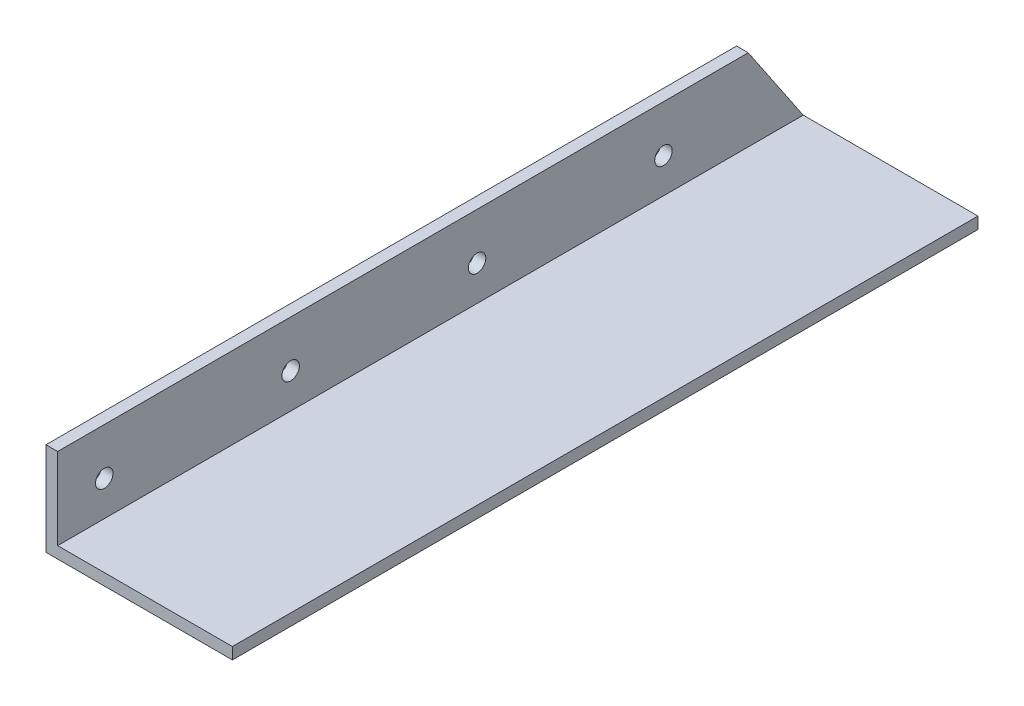
ISO-10303-21;
HEADER;
FILE_DESCRIPTION(('STEP AP214'),'2;1');
FILE_NAME('part.step','',(''),(''),'','','');
FILE_SCHEMA(('AUTOMOTIVE_DESIGN { 1 0 10303 214 1 1 1 1 }'));
ENDSEC;
DATA;
#1=APPLICATION_CONTEXT('core data for automotive mechanical design processes');
#2=APPLICATION_PROTOCOL_DEFINITION('international standard','automotive_design',2000,#1);
#3=PRODUCT_CONTEXT('',#1,'mechanical');
#4=PRODUCT('Part','Part','',(#3));
#5=PRODUCT_RELATED_PRODUCT_CATEGORY('part','',(#4));
#6=PRODUCT_DEFINITION_FORMATION('','',#4);
#7=PRODUCT_DEFINITION_CONTEXT('part definition',#1,'design');
#8=PRODUCT_DEFINITION('design','',#6,#7);
#9=PRODUCT_DEFINITION_SHAPE('','',#8);
#10=(LENGTH_UNIT() NAMED_UNIT(*) SI_UNIT(.MILLI.,.METRE.));
#11=(NAMED_UNIT(*) PLANE_ANGLE_UNIT() SI_UNIT($,.RADIAN.));
#12=(NAMED_UNIT(*) SI_UNIT($,.STERADIAN.) SOLID_ANGLE_UNIT());
#13=UNCERTAINTY_MEASURE_WITH_UNIT(LENGTH_MEASURE(1.E-05),#10,'distance_accuracy_value','');
#14=(GEOMETRIC_REPRESENTATION_CONTEXT(3) GLOBAL_UNCERTAINTY_ASSIGNED_CONTEXT((#13)) GLOBAL_UNIT_ASSIGNED_CONTEXT((#10,
#11,#12)) REPRESENTATION_CONTEXT('',''));
#15=CARTESIAN_POINT('',(0.,0.,0.));
#16=DIRECTION('',(0.,0.,1.));
#17=DIRECTION('',(1.,0.,0.));
#18=AXIS2_PLACEMENT_3D('',#15,#16,#17);
#19=CARTESIAN_POINT('',(3.175,0.,203.2));
#20=DIRECTION('',(1.,0.,0.));
#21=DIRECTION('',(0.,1.,0.));
#22=AXIS2_PLACEMENT_3D('',#19,#20,#21);
#23=PLANE('',#22);
#24=CARTESIAN_POINT('',(3.175,12.7,190.5));
#25=DIRECTION('',(1.,0.,0.));
#26=DIRECTION('',(0.,1.,0.));
#27=AXIS2_PLACEMENT_3D('',#24,#25,#26);
#28=CIRCLE('',#27,2.38125000000001);
#29=CARTESIAN_POINT('',(3.175,15.08125,190.5));
#30=VERTEX_POINT('',#29);
#31=EDGE_CURVE('E130',#30,#30,#28,.T.);
#32=ORIENTED_EDGE('',*,*,#31,.F.);
#33=EDGE_LOOP('',(#32));
#34=FACE_BOUND('',#33,.T.);
#35=CARTESIAN_POINT('',(3.175,12.7,139.7));
#36=DIRECTION('',(1.,0.,0.));
#37=DIRECTION('',(0.,1.,0.));
#38=AXIS2_PLACEMENT_3D('',#35,#36,#37);
#39=CIRCLE('',#38,2.38125000000001);
#40=CARTESIAN_POINT('',(3.175,15.08125,139.7));
#41=VERTEX_POINT('',#40);
#42=EDGE_CURVE('E214',#41,#41,#39,.T.);
#43=ORIENTED_EDGE('',*,*,#42,.F.);
#44=EDGE_LOOP('',(#43));
#45=FACE_BOUND('',#44,.T.);
#46=CARTESIAN_POINT('',(3.175,12.7,88.9000000000001));
#47=DIRECTION('',(1.,0.,0.));
#48=DIRECTION('',(0.,1.,0.));
#49=AXIS2_PLACEMENT_3D('',#46,#47,#48);
#50=CIRCLE('',#49,2.38125000000001);
#51=CARTESIAN_POINT('',(3.175,15.08125,88.9000000000001));
#52=VERTEX_POINT('',#51);
#53=EDGE_CURVE('E233',#52,#52,#50,.T.);
#54=ORIENTED_EDGE('',*,*,#53,.F.);
#55=EDGE_LOOP('',(#54));
#56=FACE_BOUND('',#55,.T.);
#57=CARTESIAN_POINT('',(3.175,12.7,38.1000000000001));
#58=DIRECTION('',(1.,0.,0.));
#59=DIRECTION('',(0.,1.,0.));
#60=AXIS2_PLACEMENT_3D('',#57,#58,#59);
#61=CIRCLE('',#60,2.38125000000001);
#62=CARTESIAN_POINT('',(3.175,15.08125,38.1000000000001));
#63=VERTEX_POINT('',#62);
#64=EDGE_CURVE('E223',#63,#63,#61,.T.);
#65=ORIENTED_EDGE('',*,*,#64,.F.);
#66=EDGE_LOOP('',(#65));
#67=FACE_BOUND('',#66,.T.);
#68=DIRECTION('',(0.,0.,-1.));
#69=VECTOR('',#68,1.);
#70=CARTESIAN_POINT('',(3.175,3.175,203.2));
#71=LINE('',#70,#69);
#72=CARTESIAN_POINT('',(3.175,3.175,203.2));
#73=VERTEX_POINT('',#72);
#74=CARTESIAN_POINT('',(3.175,3.175,0.));
#75=VERTEX_POINT('',#74);
#76=EDGE_CURVE('E125',#73,#75,#71,.T.);
#77=ORIENTED_EDGE('',*,*,#76,.T.);
#78=DIRECTION('',(0.,0.829037572555043,0.559192903470745));
#79=VECTOR('',#78,1.);
#80=CARTESIAN_POINT('',(3.17499999999999,95.1946916569376,62.0680657398183));
#81=LINE('',#80,#79);
#82=CARTESIAN_POINT('',(3.175,25.4,14.9909517868229));
#83=VERTEX_POINT('',#82);
#84=EDGE_CURVE('E66',#75,#83,#81,.T.);
#85=ORIENTED_EDGE('',*,*,#84,.T.);
#86=DIRECTION('',(0.,0.,-1.));
#87=VECTOR('',#86,1.);
#88=CARTESIAN_POINT('',(3.175,25.4,203.2));
#89=LINE('',#88,#87);
#90=CARTESIAN_POINT('',(3.175,25.4,203.2));
#91=VERTEX_POINT('',#90);
#92=EDGE_CURVE('E96',#91,#83,#89,.T.);
#93=ORIENTED_EDGE('',*,*,#92,.F.);
#94=DIRECTION('',(0.,-1.,0.));
#95=VECTOR('',#94,1.);
#96=CARTESIAN_POINT('',(3.175,0.,203.2));
#97=LINE('',#96,#95);
#98=EDGE_CURVE('E98',#91,#73,#97,.T.);
#99=ORIENTED_EDGE('',*,*,#98,.T.);
#100=EDGE_LOOP('',(#77,#85,#93,#99));
#101=FACE_BOUND('',#100,.T.);
#102=ADVANCED_FACE('F43',(#34,#45,#56,#67,#101),#23,.T.);
#103=CARTESIAN_POINT('',(0.,25.4,203.2));
#104=DIRECTION('',(0.,1.,0.));
#105=DIRECTION('',(-1.,0.,0.));
#106=AXIS2_PLACEMENT_3D('',#103,#104,#105);
#107=PLANE('',#106);
#108=ORIENTED_EDGE('',*,*,#92,.T.);
#109=DIRECTION('',(-1.,0.,0.));
#110=VECTOR('',#109,1.);
#111=CARTESIAN_POINT('',(0.,25.4,14.9909517868229));
#112=LINE('',#111,#110);
#113=CARTESIAN_POINT('',(0.,25.4,14.9909517868229));
#114=VERTEX_POINT('',#113);
#115=EDGE_CURVE('E52',#83,#114,#112,.T.);
#116=ORIENTED_EDGE('',*,*,#115,.T.);
#117=DIRECTION('',(0.,0.,-1.));
#118=VECTOR('',#117,1.);
#119=CARTESIAN_POINT('',(0.,25.4,203.2));
#120=LINE('',#119,#118);
#121=CARTESIAN_POINT('',(0.,25.4,203.2));
#122=VERTEX_POINT('',#121);
#123=EDGE_CURVE('E101',#122,#114,#120,.T.);
#124=ORIENTED_EDGE('',*,*,#123,.F.);
#125=DIRECTION('',(1.,0.,0.));
#126=VECTOR('',#125,1.);
#127=CARTESIAN_POINT('',(0.,25.4,203.2));
#128=LINE('',#127,#126);
#129=EDGE_CURVE('E107',#122,#91,#128,.T.);
#130=ORIENTED_EDGE('',*,*,#129,.T.);
#131=EDGE_LOOP('',(#108,#116,#124,#130));
#132=FACE_BOUND('',#131,.T.);
#133=ADVANCED_FACE('F114',(#132),#107,.T.);
#134=CARTESIAN_POINT('',(0.,0.,203.2));
#135=DIRECTION('',(-1.,0.,0.));
#136=DIRECTION('',(0.,0.,1.));
#137=AXIS2_PLACEMENT_3D('',#134,#135,#136);
#138=PLANE('',#137);
#139=CARTESIAN_POINT('',(0.,12.7,190.5));
#140=DIRECTION('',(-1.,0.,0.));
#141=DIRECTION('',(0.,0.,1.));
#142=AXIS2_PLACEMENT_3D('',#139,#140,#141);
#143=CIRCLE('',#142,2.38125000000001);
#144=CARTESIAN_POINT('',(0.,12.7,192.88125));
#145=VERTEX_POINT('',#144);
#146=EDGE_CURVE('E219',#145,#145,#143,.T.);
#147=ORIENTED_EDGE('',*,*,#146,.F.);
#148=EDGE_LOOP('',(#147));
#149=FACE_BOUND('',#148,.T.);
#150=CARTESIAN_POINT('',(0.,12.7,139.7));
#151=DIRECTION('',(-1.,0.,0.));
#152=DIRECTION('',(0.,0.,1.));
#153=AXIS2_PLACEMENT_3D('',#150,#151,#152);
#154=CIRCLE('',#153,2.38125000000001);
#155=CARTESIAN_POINT('',(0.,12.7,142.08125));
#156=VERTEX_POINT('',#155);
#157=EDGE_CURVE('E217',#156,#156,#154,.T.);
#158=ORIENTED_EDGE('',*,*,#157,.F.);
#159=EDGE_LOOP('',(#158));
#160=FACE_BOUND('',#159,.T.);
#161=CARTESIAN_POINT('',(0.,12.7,88.9000000000001));
#162=DIRECTION('',(-1.,0.,0.));
#163=DIRECTION('',(0.,0.,1.));
#164=AXIS2_PLACEMENT_3D('',#161,#162,#163);
#165=CIRCLE('',#164,2.38125000000001);
#166=CARTESIAN_POINT('',(0.,12.7,91.2812500000001));
#167=VERTEX_POINT('',#166);
#168=EDGE_CURVE('E220',#167,#167,#165,.T.);
#169=ORIENTED_EDGE('',*,*,#168,.F.);
#170=EDGE_LOOP('',(#169));
#171=FACE_BOUND('',#170,.T.);
#172=CARTESIAN_POINT('',(0.,12.7,38.1000000000001));
#173=DIRECTION('',(-1.,0.,0.));
#174=DIRECTION('',(0.,0.,1.));
#175=AXIS2_PLACEMENT_3D('',#172,#173,#174);
#176=CIRCLE('',#175,2.38125000000001);
#177=CARTESIAN_POINT('',(0.,12.7,40.4812500000001));
#178=VERTEX_POINT('',#177);
#179=EDGE_CURVE('E226',#178,#178,#176,.T.);
#180=ORIENTED_EDGE('',*,*,#179,.F.);
#181=EDGE_LOOP('',(#180));
#182=FACE_BOUND('',#181,.T.);
#183=ORIENTED_EDGE('',*,*,#123,.T.);
#184=DIRECTION('',(0.,-0.829037572555043,-0.559192903470745));
#185=VECTOR('',#184,1.);
#186=CARTESIAN_POINT('',(0.,95.1946916569376,62.0680657398183));
#187=LINE('',#186,#185);
#188=CARTESIAN_POINT('',(0.,3.17499999999989,0.));
#189=VERTEX_POINT('',#188);
#190=EDGE_CURVE('E11',#114,#189,#187,.T.);
#191=ORIENTED_EDGE('',*,*,#190,.T.);
#192=DIRECTION('',(0.,1.,0.));
#193=VECTOR('',#192,1.);
#194=CARTESIAN_POINT('',(0.,0.,0.));
#195=LINE('',#194,#193);
#196=CARTESIAN_POINT('',(0.,0.,0.));
#197=VERTEX_POINT('',#196);
#198=EDGE_CURVE('E126',#197,#189,#195,.T.);
#199=ORIENTED_EDGE('',*,*,#198,.F.);
#200=DIRECTION('',(0.,0.,-1.));
#201=VECTOR('',#200,1.);
#202=CARTESIAN_POINT('',(0.,0.,203.2));
#203=LINE('',#202,#201);
#204=CARTESIAN_POINT('',(0.,0.,203.2));
#205=VERTEX_POINT('',#204);
#206=EDGE_CURVE('E143',#205,#197,#203,.T.);
#207=ORIENTED_EDGE('',*,*,#206,.F.);
#208=DIRECTION('',(0.,1.,0.));
#209=VECTOR('',#208,1.);
#210=CARTESIAN_POINT('',(0.,0.,203.2));
#211=LINE('',#210,#209);
#212=EDGE_CURVE('E115',#205,#122,#211,.T.);
#213=ORIENTED_EDGE('',*,*,#212,.T.);
#214=EDGE_LOOP('',(#183,#191,#199,#207,#213));
#215=FACE_BOUND('',#214,.T.);
#216=ADVANCED_FACE('F166',(#149,#160,#171,#182,#215),#138,.T.);
#217=CARTESIAN_POINT('',(0.,0.,203.2));
#218=DIRECTION('',(0.,1.,0.));
#219=DIRECTION('',(0.,0.,1.));
#220=AXIS2_PLACEMENT_3D('',#217,#218,#219);
#221=PLANE('',#220);
#222=DIRECTION('',(1.,0.,0.));
#223=VECTOR('',#222,1.);
#224=CARTESIAN_POINT('',(0.,0.,0.));
#225=LINE('',#224,#223);
#226=CARTESIAN_POINT('',(50.8,0.,0.));
#227=VERTEX_POINT('',#226);
#228=EDGE_CURVE('E129',#197,#227,#225,.T.);
#229=ORIENTED_EDGE('',*,*,#228,.T.);
#230=DIRECTION('',(0.,0.,-1.));
#231=VECTOR('',#230,1.);
#232=CARTESIAN_POINT('',(50.8,0.,203.2));
#233=LINE('',#232,#231);
#234=CARTESIAN_POINT('',(50.8,0.,203.2));
#235=VERTEX_POINT('',#234);
#236=EDGE_CURVE('E140',#235,#227,#233,.T.);
#237=ORIENTED_EDGE('',*,*,#236,.F.);
#238=DIRECTION('',(1.,0.,0.));
#239=VECTOR('',#238,1.);
#240=CARTESIAN_POINT('',(0.,0.,203.2));
#241=LINE('',#240,#239);
#242=EDGE_CURVE('E117',#205,#235,#241,.T.);
#243=ORIENTED_EDGE('',*,*,#242,.F.);
#244=ORIENTED_EDGE('',*,*,#206,.T.);
#245=EDGE_LOOP('',(#229,#237,#243,#244));
#246=FACE_BOUND('',#245,.T.);
#247=ADVANCED_FACE('F187',(#246),#221,.F.);
#248=CARTESIAN_POINT('',(50.8,0.,203.2));
#249=DIRECTION('',(-1.,0.,0.));
#250=DIRECTION('',(0.,0.,1.));
#251=AXIS2_PLACEMENT_3D('',#248,#249,#250);
#252=PLANE('',#251);
#253=DIRECTION('',(0.,1.,0.));
#254=VECTOR('',#253,1.);
#255=CARTESIAN_POINT('',(50.8,0.,0.));
#256=LINE('',#255,#254);
#257=CARTESIAN_POINT('',(50.8,3.175,0.));
#258=VERTEX_POINT('',#257);
#259=EDGE_CURVE('E132',#227,#258,#256,.T.);
#260=ORIENTED_EDGE('',*,*,#259,.T.);
#261=DIRECTION('',(0.,0.,-1.));
#262=VECTOR('',#261,1.);
#263=CARTESIAN_POINT('',(50.8,3.175,203.2));
#264=LINE('',#263,#262);
#265=CARTESIAN_POINT('',(50.8,3.175,203.2));
#266=VERTEX_POINT('',#265);
#267=EDGE_CURVE('E137',#266,#258,#264,.T.);
#268=ORIENTED_EDGE('',*,*,#267,.F.);
#269=DIRECTION('',(0.,1.,0.));
#270=VECTOR('',#269,1.);
#271=CARTESIAN_POINT('',(50.8,0.,203.2));
#272=LINE('',#271,#270);
#273=EDGE_CURVE('E122',#235,#266,#272,.T.);
#274=ORIENTED_EDGE('',*,*,#273,.F.);
#275=ORIENTED_EDGE('',*,*,#236,.T.);
#276=EDGE_LOOP('',(#260,#268,#274,#275));
#277=FACE_BOUND('',#276,.T.);
#278=ADVANCED_FACE('F162',(#277),#252,.F.);
#279=CARTESIAN_POINT('',(0.,3.175,203.2));
#280=DIRECTION('',(0.,-1.,0.));
#281=DIRECTION('',(1.,0.,0.));
#282=AXIS2_PLACEMENT_3D('',#279,#280,#281);
#283=PLANE('',#282);
#284=DIRECTION('',(-1.,0.,0.));
#285=VECTOR('',#284,1.);
#286=CARTESIAN_POINT('',(0.,3.175,0.));
#287=LINE('',#286,#285);
#288=EDGE_CURVE('E112',#258,#75,#287,.T.);
#289=ORIENTED_EDGE('',*,*,#288,.T.);
#290=ORIENTED_EDGE('',*,*,#76,.F.);
#291=DIRECTION('',(-1.,0.,0.));
#292=VECTOR('',#291,1.);
#293=CARTESIAN_POINT('',(0.,3.175,203.2));
#294=LINE('',#293,#292);
#295=EDGE_CURVE('E110',#266,#73,#294,.T.);
#296=ORIENTED_EDGE('',*,*,#295,.F.);
#297=ORIENTED_EDGE('',*,*,#267,.T.);
#298=EDGE_LOOP('',(#289,#290,#296,#297));
#299=FACE_BOUND('',#298,.T.);
#300=ADVANCED_FACE('F158',(#299),#283,.F.);
#301=CARTESIAN_POINT('',(0.,0.,203.2));
#302=DIRECTION('',(0.,0.,1.));
#303=DIRECTION('',(1.,0.,0.));
#304=AXIS2_PLACEMENT_3D('',#301,#302,#303);
#305=PLANE('',#304);
#306=ORIENTED_EDGE('',*,*,#98,.F.);
#307=ORIENTED_EDGE('',*,*,#129,.F.);
#308=ORIENTED_EDGE('',*,*,#212,.F.);
#309=ORIENTED_EDGE('',*,*,#242,.T.);
#310=ORIENTED_EDGE('',*,*,#273,.T.);
#311=ORIENTED_EDGE('',*,*,#295,.T.);
#312=EDGE_LOOP('',(#306,#307,#308,#309,#310,#311));
#313=FACE_BOUND('',#312,.T.);
#314=ADVANCED_FACE('F105',(#313),#305,.T.);
#315=CARTESIAN_POINT('',(0.,0.,0.));
#316=DIRECTION('',(0.,0.,1.));
#317=DIRECTION('',(1.,0.,0.));
#318=AXIS2_PLACEMENT_3D('',#315,#316,#317);
#319=PLANE('',#318);
#320=ORIENTED_EDGE('',*,*,#198,.T.);
#321=DIRECTION('',(1.,0.,0.));
#322=VECTOR('',#321,1.);
#323=CARTESIAN_POINT('',(3.175,3.17499999999989,0.));
#324=LINE('',#323,#322);
#325=EDGE_CURVE('E100',#189,#75,#324,.T.);
#326=ORIENTED_EDGE('',*,*,#325,.T.);
#327=ORIENTED_EDGE('',*,*,#288,.F.);
#328=ORIENTED_EDGE('',*,*,#259,.F.);
#329=ORIENTED_EDGE('',*,*,#228,.F.);
#330=EDGE_LOOP('',(#320,#326,#327,#328,#329));
#331=FACE_BOUND('',#330,.T.);
#332=ADVANCED_FACE('F151',(#331),#319,.F.);
#333=CARTESIAN_POINT('',(50.8,12.7,38.1000000000001));
#334=DIRECTION('',(-1.,0.,0.));
#335=DIRECTION('',(0.,0.,1.));
#336=AXIS2_PLACEMENT_3D('',#333,#334,#335);
#337=CYLINDRICAL_SURFACE('',#336,2.38125000000001);
#338=ORIENTED_EDGE('',*,*,#64,.T.);
#339=EDGE_LOOP('',(#338));
#340=FACE_BOUND('',#339,.T.);
#341=ORIENTED_EDGE('',*,*,#179,.T.);
#342=EDGE_LOOP('',(#341));
#343=FACE_BOUND('',#342,.T.);
#344=ADVANCED_FACE('F197',(#340,#343),#337,.F.);
#345=CARTESIAN_POINT('',(50.8,12.7,88.9000000000001));
#346=DIRECTION('',(-1.,0.,0.));
#347=DIRECTION('',(0.,0.,1.));
#348=AXIS2_PLACEMENT_3D('',#345,#346,#347);
#349=CYLINDRICAL_SURFACE('',#348,2.38125000000001);
#350=ORIENTED_EDGE('',*,*,#53,.T.);
#351=EDGE_LOOP('',(#350));
#352=FACE_BOUND('',#351,.T.);
#353=ORIENTED_EDGE('',*,*,#168,.T.);
#354=EDGE_LOOP('',(#353));
#355=FACE_BOUND('',#354,.T.);
#356=ADVANCED_FACE('F202',(#352,#355),#349,.F.);
#357=CARTESIAN_POINT('',(50.8,12.7,139.7));
#358=DIRECTION('',(-1.,0.,0.));
#359=DIRECTION('',(0.,0.,1.));
#360=AXIS2_PLACEMENT_3D('',#357,#358,#359);
#361=CYLINDRICAL_SURFACE('',#360,2.38125000000001);
#362=ORIENTED_EDGE('',*,*,#42,.T.);
#363=EDGE_LOOP('',(#362));
#364=FACE_BOUND('',#363,.T.);
#365=ORIENTED_EDGE('',*,*,#157,.T.);
#366=EDGE_LOOP('',(#365));
#367=FACE_BOUND('',#366,.T.);
#368=ADVANCED_FACE('F173',(#364,#367),#361,.F.);
#369=CARTESIAN_POINT('',(50.8,12.7,190.5));
#370=DIRECTION('',(-1.,0.,0.));
#371=DIRECTION('',(0.,0.,1.));
#372=AXIS2_PLACEMENT_3D('',#369,#370,#371);
#373=CYLINDRICAL_SURFACE('',#372,2.38125000000001);
#374=ORIENTED_EDGE('',*,*,#31,.T.);
#375=EDGE_LOOP('',(#374));
#376=FACE_BOUND('',#375,.T.);
#377=ORIENTED_EDGE('',*,*,#146,.T.);
#378=EDGE_LOOP('',(#377));
#379=FACE_BOUND('',#378,.T.);
#380=ADVANCED_FACE('F169',(#376,#379),#373,.F.);
#381=CARTESIAN_POINT('',(0.,3.17499999999989,0.));
#382=DIRECTION('',(0.,0.559192903470745,-0.829037572555043));
#383=DIRECTION('',(-1.,0.,0.));
#384=AXIS2_PLACEMENT_3D('',#381,#382,#383);
#385=PLANE('',#384);
#386=ORIENTED_EDGE('',*,*,#190,.F.);
#387=ORIENTED_EDGE('',*,*,#115,.F.);
#388=ORIENTED_EDGE('',*,*,#84,.F.);
#389=ORIENTED_EDGE('',*,*,#325,.F.);
#390=EDGE_LOOP('',(#386,#387,#388,#389));
#391=FACE_BOUND('',#390,.T.);
#392=ADVANCED_FACE('F46',(#391),#385,.T.);
#393=CLOSED_SHELL('',(#102,#133,#216,#247,#278,#300,#314,#332,#344,#356,#368,#380,#392));
#394=MANIFOLD_SOLID_BREP('B2',#393);
#395=ADVANCED_BREP_SHAPE_REPRESENTATION('',(#18,#394),#14);
#396=SHAPE_DEFINITION_REPRESENTATION(#9,#395);
ENDSEC;
END-ISO-10303-21;
